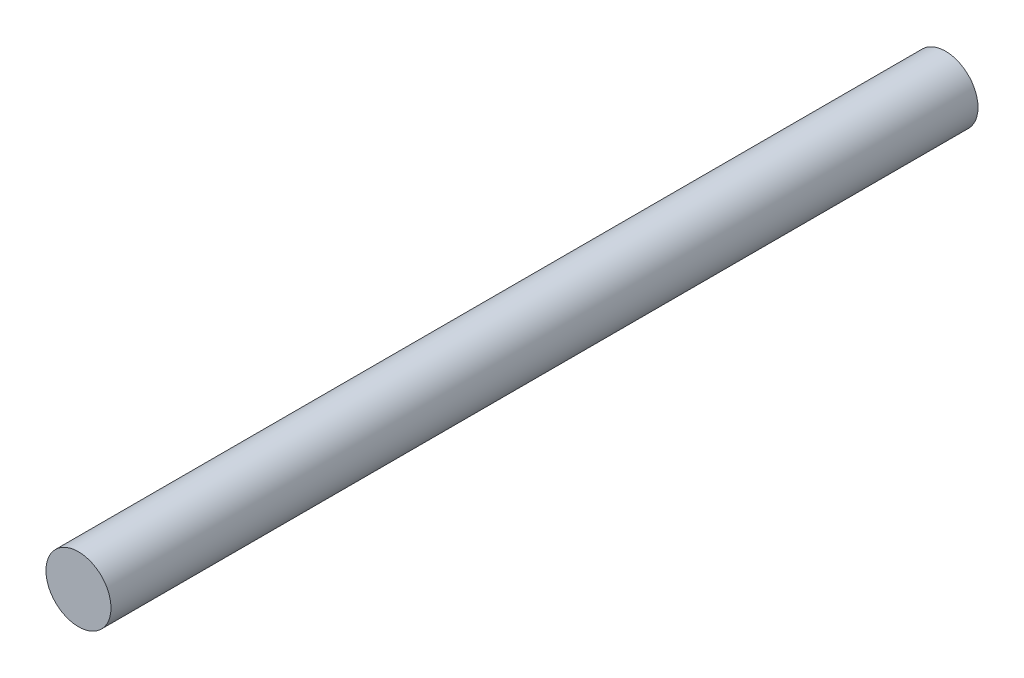
ISO-10303-21;
HEADER;
FILE_DESCRIPTION(('STEP AP214'),'2;1');
FILE_NAME('part.step','',(''),(''),'','','');
FILE_SCHEMA(('AUTOMOTIVE_DESIGN { 1 0 10303 214 1 1 1 1 }'));
ENDSEC;
DATA;
#1=APPLICATION_CONTEXT('core data for automotive mechanical design processes');
#2=APPLICATION_PROTOCOL_DEFINITION('international standard','automotive_design',2000,#1);
#3=PRODUCT_CONTEXT('',#1,'mechanical');
#4=PRODUCT('Part','Part','',(#3));
#5=PRODUCT_RELATED_PRODUCT_CATEGORY('part','',(#4));
#6=PRODUCT_DEFINITION_FORMATION('','',#4);
#7=PRODUCT_DEFINITION_CONTEXT('part definition',#1,'design');
#8=PRODUCT_DEFINITION('design','',#6,#7);
#9=PRODUCT_DEFINITION_SHAPE('','',#8);
#10=(LENGTH_UNIT() NAMED_UNIT(*) SI_UNIT(.MILLI.,.METRE.));
#11=(NAMED_UNIT(*) PLANE_ANGLE_UNIT() SI_UNIT($,.RADIAN.));
#12=(NAMED_UNIT(*) SI_UNIT($,.STERADIAN.) SOLID_ANGLE_UNIT());
#13=UNCERTAINTY_MEASURE_WITH_UNIT(LENGTH_MEASURE(1.E-05),#10,'distance_accuracy_value','');
#14=(GEOMETRIC_REPRESENTATION_CONTEXT(3) GLOBAL_UNCERTAINTY_ASSIGNED_CONTEXT((#13)) GLOBAL_UNIT_ASSIGNED_CONTEXT((#10,
#11,#12)) REPRESENTATION_CONTEXT('',''));
#15=CARTESIAN_POINT('',(0.,0.,0.));
#16=DIRECTION('',(0.,0.,1.));
#17=DIRECTION('',(1.,0.,0.));
#18=AXIS2_PLACEMENT_3D('',#15,#16,#17);
#19=CARTESIAN_POINT('',(0.,0.,20.));
#20=DIRECTION('',(0.,0.,-1.));
#21=DIRECTION('',(-1.,0.,0.));
#22=AXIS2_PLACEMENT_3D('',#19,#20,#21);
#23=CYLINDRICAL_SURFACE('',#22,1.5);
#24=CARTESIAN_POINT('',(0.,0.,20.));
#25=DIRECTION('',(0.,0.,1.));
#26=DIRECTION('',(1.,0.,0.));
#27=AXIS2_PLACEMENT_3D('',#24,#25,#26);
#28=CIRCLE('',#27,1.5);
#29=CARTESIAN_POINT('',(1.5,0.,20.));
#30=VERTEX_POINT('',#29);
#31=EDGE_CURVE('E10',#30,#30,#28,.T.);
#32=ORIENTED_EDGE('',*,*,#31,.F.);
#33=EDGE_LOOP('',(#32));
#34=FACE_BOUND('',#33,.T.);
#35=CARTESIAN_POINT('',(0.,0.,-20.));
#36=DIRECTION('',(0.,0.,1.));
#37=DIRECTION('',(1.,0.,0.));
#38=AXIS2_PLACEMENT_3D('',#35,#36,#37);
#39=CIRCLE('',#38,1.5);
#40=CARTESIAN_POINT('',(1.5,0.,-20.));
#41=VERTEX_POINT('',#40);
#42=EDGE_CURVE('E47',#41,#41,#39,.T.);
#43=ORIENTED_EDGE('',*,*,#42,.T.);
#44=EDGE_LOOP('',(#43));
#45=FACE_BOUND('',#44,.T.);
#46=ADVANCED_FACE('F44',(#34,#45),#23,.T.);
#47=CARTESIAN_POINT('',(0.,0.,20.));
#48=DIRECTION('',(0.,0.,1.));
#49=DIRECTION('',(1.,0.,0.));
#50=AXIS2_PLACEMENT_3D('',#47,#48,#49);
#51=PLANE('',#50);
#52=ORIENTED_EDGE('',*,*,#31,.T.);
#53=EDGE_LOOP('',(#52));
#54=FACE_BOUND('',#53,.T.);
#55=ADVANCED_FACE('F63',(#54),#51,.T.);
#56=CARTESIAN_POINT('',(0.,0.,-20.));
#57=DIRECTION('',(0.,0.,1.));
#58=DIRECTION('',(1.,0.,0.));
#59=AXIS2_PLACEMENT_3D('',#56,#57,#58);
#60=PLANE('',#59);
#61=ORIENTED_EDGE('',*,*,#42,.F.);
#62=EDGE_LOOP('',(#61));
#63=FACE_BOUND('',#62,.T.);
#64=ADVANCED_FACE('F56',(#63),#60,.F.);
#65=CLOSED_SHELL('',(#46,#55,#64));
#66=MANIFOLD_SOLID_BREP('B2',#65);
#67=ADVANCED_BREP_SHAPE_REPRESENTATION('',(#18,#66),#14);
#68=SHAPE_DEFINITION_REPRESENTATION(#9,#67);
ENDSEC;
END-ISO-10303-21;
